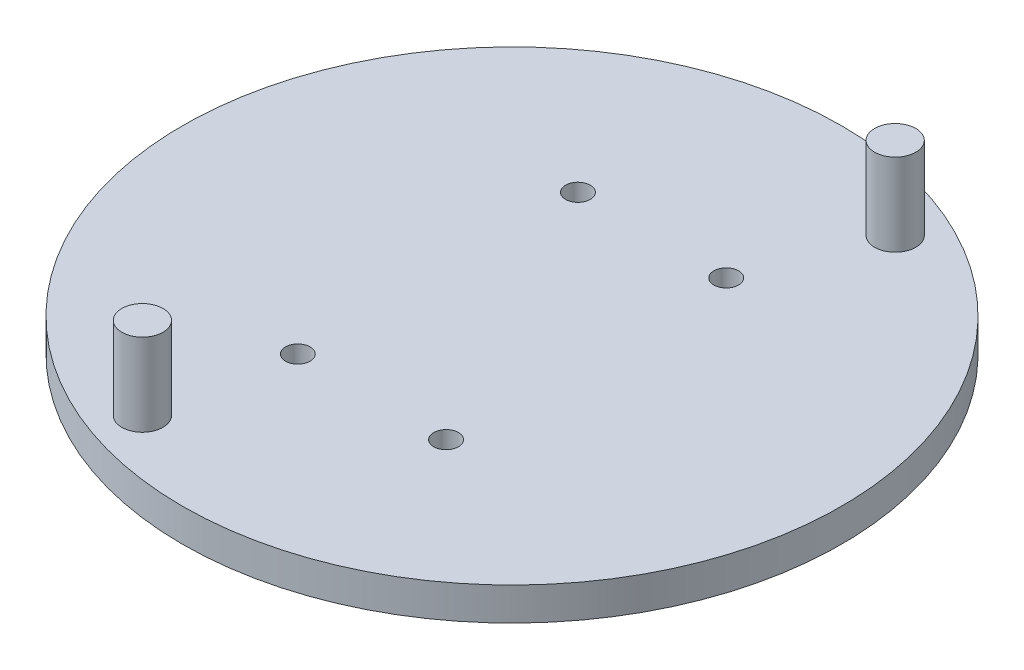
ISO-10303-21;
HEADER;
FILE_DESCRIPTION(('STEP AP214'),'2;1');
FILE_NAME('part.step','',(''),(''),'','','');
FILE_SCHEMA(('AUTOMOTIVE_DESIGN { 1 0 10303 214 1 1 1 1 }'));
ENDSEC;
DATA;
#1=APPLICATION_CONTEXT('core data for automotive mechanical design processes');
#2=APPLICATION_PROTOCOL_DEFINITION('international standard','automotive_design',2000,#1);
#3=PRODUCT_CONTEXT('',#1,'mechanical');
#4=PRODUCT('Part','Part','',(#3));
#5=PRODUCT_RELATED_PRODUCT_CATEGORY('part','',(#4));
#6=PRODUCT_DEFINITION_FORMATION('','',#4);
#7=PRODUCT_DEFINITION_CONTEXT('part definition',#1,'design');
#8=PRODUCT_DEFINITION('design','',#6,#7);
#9=PRODUCT_DEFINITION_SHAPE('','',#8);
#10=(LENGTH_UNIT() NAMED_UNIT(*) SI_UNIT(.MILLI.,.METRE.));
#11=(NAMED_UNIT(*) PLANE_ANGLE_UNIT() SI_UNIT($,.RADIAN.));
#12=(NAMED_UNIT(*) SI_UNIT($,.STERADIAN.) SOLID_ANGLE_UNIT());
#13=UNCERTAINTY_MEASURE_WITH_UNIT(LENGTH_MEASURE(1.E-05),#10,'distance_accuracy_value','');
#14=(GEOMETRIC_REPRESENTATION_CONTEXT(3) GLOBAL_UNCERTAINTY_ASSIGNED_CONTEXT((#13)) GLOBAL_UNIT_ASSIGNED_CONTEXT((#10,
#11,#12)) REPRESENTATION_CONTEXT('',''));
#15=CARTESIAN_POINT('',(0.,0.,0.));
#16=DIRECTION('',(0.,0.,1.));
#17=DIRECTION('',(1.,0.,0.));
#18=AXIS2_PLACEMENT_3D('',#15,#16,#17);
#19=CARTESIAN_POINT('',(0.,4.,0.));
#20=DIRECTION('',(0.,1.,0.));
#21=DIRECTION('',(0.,0.,1.));
#22=AXIS2_PLACEMENT_3D('',#19,#20,#21);
#23=PLANE('',#22);
#24=CARTESIAN_POINT('',(-11.9707050163984,4.,32.8892417275068));
#25=DIRECTION('',(0.,1.,0.));
#26=DIRECTION('',(0.,0.,1.));
#27=AXIS2_PLACEMENT_3D('',#24,#25,#26);
#28=CIRCLE('',#27,2.5);
#29=CARTESIAN_POINT('',(-11.9707050163984,4.,35.3892417275068));
#30=VERTEX_POINT('',#29);
#31=EDGE_CURVE('E74',#30,#30,#28,.T.);
#32=ORIENTED_EDGE('',*,*,#31,.F.);
#33=EDGE_LOOP('',(#32));
#34=FACE_BOUND('',#33,.T.);
#35=CARTESIAN_POINT('',(14.7916391609243,4.,-31.7207725462828));
#36=DIRECTION('',(0.,1.,0.));
#37=DIRECTION('',(0.,0.,1.));
#38=AXIS2_PLACEMENT_3D('',#35,#36,#37);
#39=CIRCLE('',#38,2.5);
#40=CARTESIAN_POINT('',(14.7916391609243,4.,-29.2207725462828));
#41=VERTEX_POINT('',#40);
#42=EDGE_CURVE('E68',#41,#41,#39,.T.);
#43=ORIENTED_EDGE('',*,*,#42,.F.);
#44=EDGE_LOOP('',(#43));
#45=FACE_BOUND('',#44,.T.);
#46=CARTESIAN_POINT('',(-9.,4.,17.));
#47=DIRECTION('',(0.,1.,0.));
#48=DIRECTION('',(0.,0.,1.));
#49=AXIS2_PLACEMENT_3D('',#46,#47,#48);
#50=CIRCLE('',#49,1.5);
#51=CARTESIAN_POINT('',(-9.,4.,18.5));
#52=VERTEX_POINT('',#51);
#53=EDGE_CURVE('E53',#52,#52,#50,.T.);
#54=ORIENTED_EDGE('',*,*,#53,.F.);
#55=EDGE_LOOP('',(#54));
#56=FACE_BOUND('',#55,.T.);
#57=CARTESIAN_POINT('',(9.,4.,-17.));
#58=DIRECTION('',(0.,1.,0.));
#59=DIRECTION('',(0.,0.,1.));
#60=AXIS2_PLACEMENT_3D('',#57,#58,#59);
#61=CIRCLE('',#60,1.5);
#62=CARTESIAN_POINT('',(9.,4.,-15.5));
#63=VERTEX_POINT('',#62);
#64=EDGE_CURVE('E42',#63,#63,#61,.T.);
#65=ORIENTED_EDGE('',*,*,#64,.F.);
#66=EDGE_LOOP('',(#65));
#67=FACE_BOUND('',#66,.T.);
#68=CARTESIAN_POINT('',(0.,4.,0.));
#69=DIRECTION('',(0.,1.,0.));
#70=DIRECTION('',(0.,0.,1.));
#71=AXIS2_PLACEMENT_3D('',#68,#69,#70);
#72=CIRCLE('',#71,40.);
#73=CARTESIAN_POINT('',(0.,4.,40.));
#74=VERTEX_POINT('',#73);
#75=EDGE_CURVE('E10',#74,#74,#72,.T.);
#76=ORIENTED_EDGE('',*,*,#75,.T.);
#77=EDGE_LOOP('',(#76));
#78=FACE_BOUND('',#77,.T.);
#79=CARTESIAN_POINT('',(-9.,4.,-17.));
#80=DIRECTION('',(0.,1.,0.));
#81=DIRECTION('',(0.,0.,1.));
#82=AXIS2_PLACEMENT_3D('',#79,#80,#81);
#83=CIRCLE('',#82,1.5);
#84=CARTESIAN_POINT('',(-9.,4.,-15.5));
#85=VERTEX_POINT('',#84);
#86=EDGE_CURVE('E47',#85,#85,#83,.T.);
#87=ORIENTED_EDGE('',*,*,#86,.F.);
#88=EDGE_LOOP('',(#87));
#89=FACE_BOUND('',#88,.T.);
#90=CARTESIAN_POINT('',(9.,4.,17.));
#91=DIRECTION('',(0.,1.,0.));
#92=DIRECTION('',(0.,0.,1.));
#93=AXIS2_PLACEMENT_3D('',#90,#91,#92);
#94=CIRCLE('',#93,1.5);
#95=CARTESIAN_POINT('',(9.,4.,18.5));
#96=VERTEX_POINT('',#95);
#97=EDGE_CURVE('E59',#96,#96,#94,.T.);
#98=ORIENTED_EDGE('',*,*,#97,.F.);
#99=EDGE_LOOP('',(#98));
#100=FACE_BOUND('',#99,.T.);
#101=ADVANCED_FACE('F31',(#34,#45,#56,#67,#78,#89,#100),#23,.T.);
#102=CARTESIAN_POINT('',(0.,0.,0.));
#103=DIRECTION('',(0.,1.,0.));
#104=DIRECTION('',(0.,0.,1.));
#105=AXIS2_PLACEMENT_3D('',#102,#103,#104);
#106=PLANE('',#105);
#107=CARTESIAN_POINT('',(0.,0.,0.));
#108=DIRECTION('',(0.,1.,0.));
#109=DIRECTION('',(0.,0.,1.));
#110=AXIS2_PLACEMENT_3D('',#107,#108,#109);
#111=CIRCLE('',#110,40.);
#112=CARTESIAN_POINT('',(0.,0.,40.));
#113=VERTEX_POINT('',#112);
#114=EDGE_CURVE('E35',#113,#113,#111,.T.);
#115=ORIENTED_EDGE('',*,*,#114,.F.);
#116=EDGE_LOOP('',(#115));
#117=FACE_BOUND('',#116,.T.);
#118=CARTESIAN_POINT('',(9.,0.,-17.));
#119=DIRECTION('',(0.,1.,0.));
#120=DIRECTION('',(0.,0.,1.));
#121=AXIS2_PLACEMENT_3D('',#118,#119,#120);
#122=CIRCLE('',#121,1.5);
#123=CARTESIAN_POINT('',(9.,0.,-15.5));
#124=VERTEX_POINT('',#123);
#125=EDGE_CURVE('E44',#124,#124,#122,.T.);
#126=ORIENTED_EDGE('',*,*,#125,.T.);
#127=EDGE_LOOP('',(#126));
#128=FACE_BOUND('',#127,.T.);
#129=CARTESIAN_POINT('',(-9.,0.,-17.));
#130=DIRECTION('',(0.,1.,0.));
#131=DIRECTION('',(0.,0.,1.));
#132=AXIS2_PLACEMENT_3D('',#129,#130,#131);
#133=CIRCLE('',#132,1.5);
#134=CARTESIAN_POINT('',(-9.,0.,-15.5));
#135=VERTEX_POINT('',#134);
#136=EDGE_CURVE('E50',#135,#135,#133,.T.);
#137=ORIENTED_EDGE('',*,*,#136,.T.);
#138=EDGE_LOOP('',(#137));
#139=FACE_BOUND('',#138,.T.);
#140=CARTESIAN_POINT('',(-9.,0.,17.));
#141=DIRECTION('',(0.,1.,0.));
#142=DIRECTION('',(0.,0.,1.));
#143=AXIS2_PLACEMENT_3D('',#140,#141,#142);
#144=CIRCLE('',#143,1.5);
#145=CARTESIAN_POINT('',(-9.,0.,18.5));
#146=VERTEX_POINT('',#145);
#147=EDGE_CURVE('E56',#146,#146,#144,.T.);
#148=ORIENTED_EDGE('',*,*,#147,.T.);
#149=EDGE_LOOP('',(#148));
#150=FACE_BOUND('',#149,.T.);
#151=CARTESIAN_POINT('',(9.,0.,17.));
#152=DIRECTION('',(0.,1.,0.));
#153=DIRECTION('',(0.,0.,1.));
#154=AXIS2_PLACEMENT_3D('',#151,#152,#153);
#155=CIRCLE('',#154,1.5);
#156=CARTESIAN_POINT('',(9.,0.,18.5));
#157=VERTEX_POINT('',#156);
#158=EDGE_CURVE('E62',#157,#157,#155,.T.);
#159=ORIENTED_EDGE('',*,*,#158,.T.);
#160=EDGE_LOOP('',(#159));
#161=FACE_BOUND('',#160,.T.);
#162=ADVANCED_FACE('F91',(#117,#128,#139,#150,#161),#106,.F.);
#163=CARTESIAN_POINT('',(0.,4.,0.));
#164=DIRECTION('',(0.,-1.,0.));
#165=DIRECTION('',(0.,0.,-1.));
#166=AXIS2_PLACEMENT_3D('',#163,#164,#165);
#167=CYLINDRICAL_SURFACE('',#166,40.);
#168=ORIENTED_EDGE('',*,*,#75,.F.);
#169=EDGE_LOOP('',(#168));
#170=FACE_BOUND('',#169,.T.);
#171=ORIENTED_EDGE('',*,*,#114,.T.);
#172=EDGE_LOOP('',(#171));
#173=FACE_BOUND('',#172,.T.);
#174=ADVANCED_FACE('F33',(#170,#173),#167,.T.);
#175=CARTESIAN_POINT('',(9.,4.,-17.));
#176=DIRECTION('',(0.,-1.,0.));
#177=DIRECTION('',(0.,0.,-1.));
#178=AXIS2_PLACEMENT_3D('',#175,#176,#177);
#179=CYLINDRICAL_SURFACE('',#178,1.5);
#180=ORIENTED_EDGE('',*,*,#64,.T.);
#181=EDGE_LOOP('',(#180));
#182=FACE_BOUND('',#181,.T.);
#183=ORIENTED_EDGE('',*,*,#125,.F.);
#184=EDGE_LOOP('',(#183));
#185=FACE_BOUND('',#184,.T.);
#186=ADVANCED_FACE('F116',(#182,#185),#179,.F.);
#187=CARTESIAN_POINT('',(-9.,4.,-17.));
#188=DIRECTION('',(0.,-1.,0.));
#189=DIRECTION('',(0.,0.,-1.));
#190=AXIS2_PLACEMENT_3D('',#187,#188,#189);
#191=CYLINDRICAL_SURFACE('',#190,1.5);
#192=ORIENTED_EDGE('',*,*,#86,.T.);
#193=EDGE_LOOP('',(#192));
#194=FACE_BOUND('',#193,.T.);
#195=ORIENTED_EDGE('',*,*,#136,.F.);
#196=EDGE_LOOP('',(#195));
#197=FACE_BOUND('',#196,.T.);
#198=ADVANCED_FACE('F123',(#194,#197),#191,.F.);
#199=CARTESIAN_POINT('',(-9.,4.,17.));
#200=DIRECTION('',(0.,-1.,0.));
#201=DIRECTION('',(0.,0.,-1.));
#202=AXIS2_PLACEMENT_3D('',#199,#200,#201);
#203=CYLINDRICAL_SURFACE('',#202,1.5);
#204=ORIENTED_EDGE('',*,*,#53,.T.);
#205=EDGE_LOOP('',(#204));
#206=FACE_BOUND('',#205,.T.);
#207=ORIENTED_EDGE('',*,*,#147,.F.);
#208=EDGE_LOOP('',(#207));
#209=FACE_BOUND('',#208,.T.);
#210=ADVANCED_FACE('F107',(#206,#209),#203,.F.);
#211=CARTESIAN_POINT('',(9.,4.,17.));
#212=DIRECTION('',(0.,-1.,0.));
#213=DIRECTION('',(0.,0.,-1.));
#214=AXIS2_PLACEMENT_3D('',#211,#212,#213);
#215=CYLINDRICAL_SURFACE('',#214,1.5);
#216=ORIENTED_EDGE('',*,*,#97,.T.);
#217=EDGE_LOOP('',(#216));
#218=FACE_BOUND('',#217,.T.);
#219=ORIENTED_EDGE('',*,*,#158,.F.);
#220=EDGE_LOOP('',(#219));
#221=FACE_BOUND('',#220,.T.);
#222=ADVANCED_FACE('F103',(#218,#221),#215,.F.);
#223=CARTESIAN_POINT('',(14.7916391609243,14.,-31.7207725462828));
#224=DIRECTION('',(0.,-1.,0.));
#225=DIRECTION('',(0.,0.,-1.));
#226=AXIS2_PLACEMENT_3D('',#223,#224,#225);
#227=CYLINDRICAL_SURFACE('',#226,2.5);
#228=CARTESIAN_POINT('',(14.7916391609243,14.,-31.7207725462828));
#229=DIRECTION('',(0.,1.,0.));
#230=DIRECTION('',(0.,0.,1.));
#231=AXIS2_PLACEMENT_3D('',#228,#229,#230);
#232=CIRCLE('',#231,2.5);
#233=CARTESIAN_POINT('',(14.7916391609243,14.,-29.2207725462828));
#234=VERTEX_POINT('',#233);
#235=EDGE_CURVE('E65',#234,#234,#232,.T.);
#236=ORIENTED_EDGE('',*,*,#235,.F.);
#237=EDGE_LOOP('',(#236));
#238=FACE_BOUND('',#237,.T.);
#239=ORIENTED_EDGE('',*,*,#42,.T.);
#240=EDGE_LOOP('',(#239));
#241=FACE_BOUND('',#240,.T.);
#242=ADVANCED_FACE('F106',(#238,#241),#227,.T.);
#243=CARTESIAN_POINT('',(14.7916391609243,14.,-31.7207725462828));
#244=DIRECTION('',(0.,1.,0.));
#245=DIRECTION('',(0.,0.,1.));
#246=AXIS2_PLACEMENT_3D('',#243,#244,#245);
#247=PLANE('',#246);
#248=ORIENTED_EDGE('',*,*,#235,.T.);
#249=EDGE_LOOP('',(#248));
#250=FACE_BOUND('',#249,.T.);
#251=ADVANCED_FACE('F85',(#250),#247,.T.);
#252=CARTESIAN_POINT('',(-11.9707050163984,14.,32.8892417275068));
#253=DIRECTION('',(0.,-1.,0.));
#254=DIRECTION('',(0.,0.,-1.));
#255=AXIS2_PLACEMENT_3D('',#252,#253,#254);
#256=CYLINDRICAL_SURFACE('',#255,2.5);
#257=CARTESIAN_POINT('',(-11.9707050163984,14.,32.8892417275068));
#258=DIRECTION('',(0.,1.,0.));
#259=DIRECTION('',(0.,0.,1.));
#260=AXIS2_PLACEMENT_3D('',#257,#258,#259);
#261=CIRCLE('',#260,2.5);
#262=CARTESIAN_POINT('',(-11.9707050163984,14.,35.3892417275068));
#263=VERTEX_POINT('',#262);
#264=EDGE_CURVE('E71',#263,#263,#261,.T.);
#265=ORIENTED_EDGE('',*,*,#264,.F.);
#266=EDGE_LOOP('',(#265));
#267=FACE_BOUND('',#266,.T.);
#268=ORIENTED_EDGE('',*,*,#31,.T.);
#269=EDGE_LOOP('',(#268));
#270=FACE_BOUND('',#269,.T.);
#271=ADVANCED_FACE('F82',(#267,#270),#256,.T.);
#272=CARTESIAN_POINT('',(-11.9707050163984,14.,32.8892417275068));
#273=DIRECTION('',(0.,1.,0.));
#274=DIRECTION('',(0.,0.,1.));
#275=AXIS2_PLACEMENT_3D('',#272,#273,#274);
#276=PLANE('',#275);
#277=ORIENTED_EDGE('',*,*,#264,.T.);
#278=EDGE_LOOP('',(#277));
#279=FACE_BOUND('',#278,.T.);
#280=ADVANCED_FACE('F80',(#279),#276,.T.);
#281=CLOSED_SHELL('',(#101,#162,#174,#186,#198,#210,#222,#242,#251,#271,#280));
#282=MANIFOLD_SOLID_BREP('B2',#281);
#283=ADVANCED_BREP_SHAPE_REPRESENTATION('',(#18,#282),#14);
#284=SHAPE_DEFINITION_REPRESENTATION(#9,#283);
ENDSEC;
END-ISO-10303-21;
